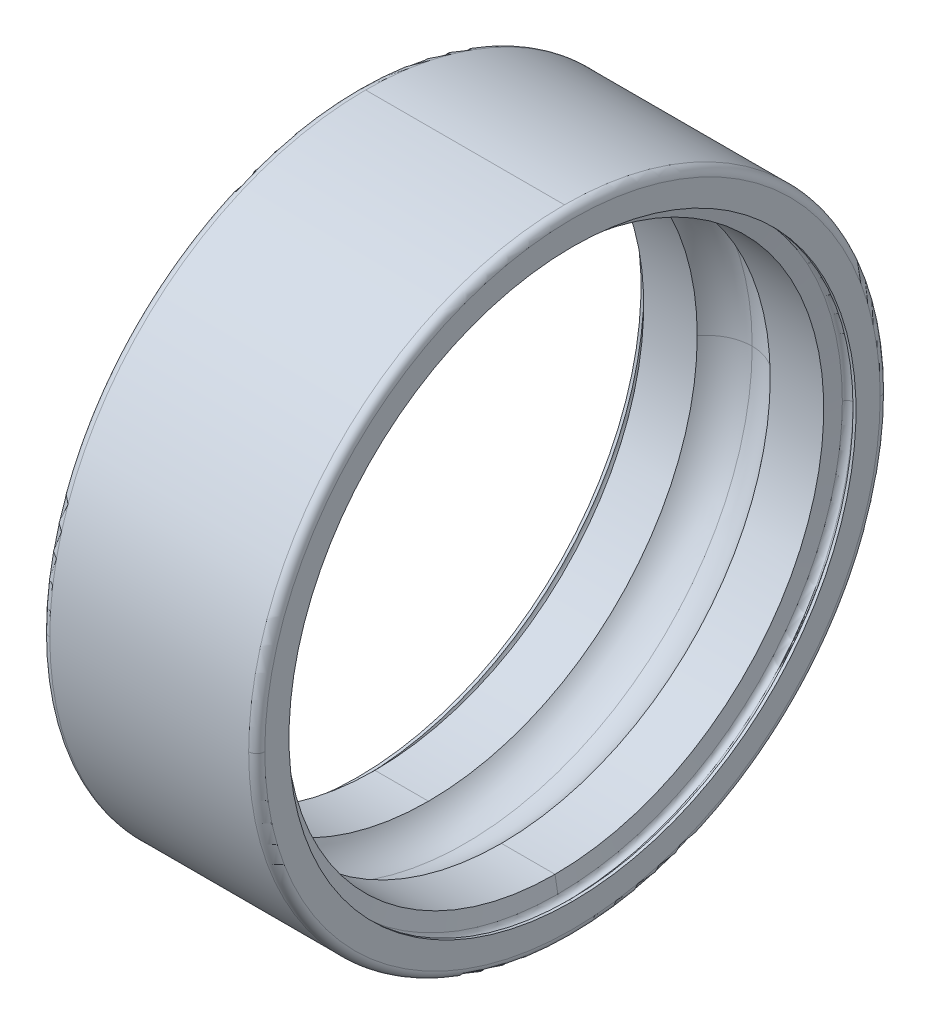
ISO-10303-21;
HEADER;
FILE_DESCRIPTION(('STEP AP214'),'2;1');
FILE_NAME('part.step','',(''),(''),'','','');
FILE_SCHEMA(('AUTOMOTIVE_DESIGN { 1 0 10303 214 1 1 1 1 }'));
ENDSEC;
DATA;
#1=APPLICATION_CONTEXT('core data for automotive mechanical design processes');
#2=APPLICATION_PROTOCOL_DEFINITION('international standard','automotive_design',2000,#1);
#3=PRODUCT_CONTEXT('',#1,'mechanical');
#4=PRODUCT('Part','Part','',(#3));
#5=PRODUCT_RELATED_PRODUCT_CATEGORY('part','',(#4));
#6=PRODUCT_DEFINITION_FORMATION('','',#4);
#7=PRODUCT_DEFINITION_CONTEXT('part definition',#1,'design');
#8=PRODUCT_DEFINITION('design','',#6,#7);
#9=PRODUCT_DEFINITION_SHAPE('','',#8);
#10=(LENGTH_UNIT() NAMED_UNIT(*) SI_UNIT(.MILLI.,.METRE.));
#11=(NAMED_UNIT(*) PLANE_ANGLE_UNIT() SI_UNIT($,.RADIAN.));
#12=(NAMED_UNIT(*) SI_UNIT($,.STERADIAN.) SOLID_ANGLE_UNIT());
#13=UNCERTAINTY_MEASURE_WITH_UNIT(LENGTH_MEASURE(1.E-05),#10,'distance_accuracy_value','');
#14=(GEOMETRIC_REPRESENTATION_CONTEXT(3) GLOBAL_UNCERTAINTY_ASSIGNED_CONTEXT((#13)) GLOBAL_UNIT_ASSIGNED_CONTEXT((#10,
#11,#12)) REPRESENTATION_CONTEXT('',''));
#15=CARTESIAN_POINT('',(0.,0.,0.));
#16=DIRECTION('',(0.,0.,1.));
#17=DIRECTION('',(1.,0.,0.));
#18=AXIS2_PLACEMENT_3D('',#15,#16,#17);
#19=CARTESIAN_POINT('',(15.34,0.,0.));
#20=DIRECTION('',(1.,0.,0.));
#21=DIRECTION('',(0.,0.,-1.));
#22=AXIS2_PLACEMENT_3D('',#19,#20,#21);
#23=TOROIDAL_SURFACE('',#22,21.1,0.44);
#24=CARTESIAN_POINT('',(15.34,0.,0.));
#25=DIRECTION('',(1.,0.,0.));
#26=DIRECTION('',(0.,0.,1.));
#27=AXIS2_PLACEMENT_3D('',#24,#25,#26);
#28=CIRCLE('',#27,21.54);
#29=CARTESIAN_POINT('',(15.34,0.,-21.54));
#30=VERTEX_POINT('',#29);
#31=CARTESIAN_POINT('',(15.34,0.,21.54));
#32=VERTEX_POINT('',#31);
#33=EDGE_CURVE('E184',#30,#32,#28,.T.);
#34=ORIENTED_EDGE('',*,*,#33,.T.);
#35=CARTESIAN_POINT('',(15.34,0.,21.1));
#36=DIRECTION('',(0.,-1.,0.));
#37=DIRECTION('',(0.,0.,1.));
#38=AXIS2_PLACEMENT_3D('',#35,#36,#37);
#39=CIRCLE('',#38,0.44);
#40=CARTESIAN_POINT('',(14.9066845886746,0.,21.1764051981735));
#41=VERTEX_POINT('',#40);
#42=EDGE_CURVE('E197',#32,#41,#39,.T.);
#43=ORIENTED_EDGE('',*,*,#42,.T.);
#44=CARTESIAN_POINT('',(14.9066845886746,0.,0.));
#45=DIRECTION('',(1.,0.,0.));
#46=DIRECTION('',(0.,1.,0.));
#47=AXIS2_PLACEMENT_3D('',#44,#45,#46);
#48=CIRCLE('',#47,21.1764051981735);
#49=CARTESIAN_POINT('',(14.9066845886746,21.1764051981735,0.));
#50=VERTEX_POINT('',#49);
#51=EDGE_CURVE('E31',#50,#41,#48,.T.);
#52=ORIENTED_EDGE('',*,*,#51,.F.);
#53=CARTESIAN_POINT('',(14.9066845886746,0.,0.));
#54=DIRECTION('',(1.,0.,0.));
#55=DIRECTION('',(0.,1.,0.));
#56=AXIS2_PLACEMENT_3D('',#53,#54,#55);
#57=CIRCLE('',#56,21.1764051981735);
#58=CARTESIAN_POINT('',(14.9066845886746,0.,-21.1764051981735));
#59=VERTEX_POINT('',#58);
#60=EDGE_CURVE('E185',#59,#50,#57,.T.);
#61=ORIENTED_EDGE('',*,*,#60,.F.);
#62=CARTESIAN_POINT('',(15.34,0.,-21.1));
#63=DIRECTION('',(0.,-1.,0.));
#64=DIRECTION('',(0.,0.,-1.));
#65=AXIS2_PLACEMENT_3D('',#62,#63,#64);
#66=CIRCLE('',#65,0.44);
#67=EDGE_CURVE('E181',#59,#30,#66,.T.);
#68=ORIENTED_EDGE('',*,*,#67,.T.);
#69=EDGE_LOOP('',(#34,#43,#52,#61,#68));
#70=FACE_BOUND('',#69,.T.);
#71=ADVANCED_FACE('F16',(#70),#23,.F.);
#72=CARTESIAN_POINT('',(15.89,0.,0.));
#73=DIRECTION('',(1.,0.,0.));
#74=DIRECTION('',(0.,1.,0.));
#75=AXIS2_PLACEMENT_3D('',#72,#73,#74);
#76=CYLINDRICAL_SURFACE('',#75,21.1);
#77=DIRECTION('',(1.,0.,0.));
#78=VECTOR('',#77,1.);
#79=CARTESIAN_POINT('',(15.89,21.1,0.));
#80=LINE('',#79,#78);
#81=CARTESIAN_POINT('',(15.78,21.1,0.));
#82=VERTEX_POINT('',#81);
#83=CARTESIAN_POINT('',(16.,21.1,0.));
#84=VERTEX_POINT('',#83);
#85=EDGE_CURVE('E312',#82,#84,#80,.T.);
#86=ORIENTED_EDGE('',*,*,#85,.T.);
#87=CARTESIAN_POINT('',(16.,0.,0.));
#88=DIRECTION('',(1.,0.,0.));
#89=DIRECTION('',(0.,1.,0.));
#90=AXIS2_PLACEMENT_3D('',#87,#88,#89);
#91=CIRCLE('',#90,21.1);
#92=CARTESIAN_POINT('',(16.,-21.1,0.));
#93=VERTEX_POINT('',#92);
#94=EDGE_CURVE('E11',#84,#93,#91,.T.);
#95=ORIENTED_EDGE('',*,*,#94,.T.);
#96=DIRECTION('',(-1.,0.,0.));
#97=VECTOR('',#96,1.);
#98=CARTESIAN_POINT('',(15.89,-21.1,0.));
#99=LINE('',#98,#97);
#100=CARTESIAN_POINT('',(15.78,-21.1,0.));
#101=VERTEX_POINT('',#100);
#102=EDGE_CURVE('E318',#93,#101,#99,.T.);
#103=ORIENTED_EDGE('',*,*,#102,.T.);
#104=CARTESIAN_POINT('',(15.78,0.,0.));
#105=DIRECTION('',(1.,0.,0.));
#106=DIRECTION('',(0.,1.,0.));
#107=AXIS2_PLACEMENT_3D('',#104,#105,#106);
#108=CIRCLE('',#107,21.1);
#109=CARTESIAN_POINT('',(15.78,0.,21.1));
#110=VERTEX_POINT('',#109);
#111=EDGE_CURVE('E201',#110,#101,#108,.T.);
#112=ORIENTED_EDGE('',*,*,#111,.F.);
#113=CARTESIAN_POINT('',(15.78,0.,0.));
#114=DIRECTION('',(1.,0.,0.));
#115=DIRECTION('',(0.,1.,0.));
#116=AXIS2_PLACEMENT_3D('',#113,#114,#115);
#117=CIRCLE('',#116,21.1);
#118=EDGE_CURVE('E240',#82,#110,#117,.T.);
#119=ORIENTED_EDGE('',*,*,#118,.F.);
#120=EDGE_LOOP('',(#86,#95,#103,#112,#119));
#121=FACE_BOUND('',#120,.T.);
#122=ADVANCED_FACE('F419',(#121),#76,.F.);
#123=CARTESIAN_POINT('',(16.,22.,0.));
#124=DIRECTION('',(1.,0.,0.));
#125=DIRECTION('',(0.,1.,0.));
#126=AXIS2_PLACEMENT_3D('',#123,#124,#125);
#127=PLANE('',#126);
#128=ORIENTED_EDGE('',*,*,#94,.F.);
#129=CARTESIAN_POINT('',(16.,0.,0.));
#130=DIRECTION('',(1.,0.,0.));
#131=DIRECTION('',(0.,1.,0.));
#132=AXIS2_PLACEMENT_3D('',#129,#130,#131);
#133=CIRCLE('',#132,21.1);
#134=EDGE_CURVE('E323',#93,#84,#133,.T.);
#135=ORIENTED_EDGE('',*,*,#134,.F.);
#136=EDGE_LOOP('',(#128,#135));
#137=FACE_BOUND('',#136,.T.);
#138=CARTESIAN_POINT('',(16.,0.,0.));
#139=DIRECTION('',(1.,0.,0.));
#140=DIRECTION('',(0.,1.,0.));
#141=AXIS2_PLACEMENT_3D('',#138,#139,#140);
#142=CIRCLE('',#141,22.9);
#143=CARTESIAN_POINT('',(16.,0.,22.9));
#144=VERTEX_POINT('',#143);
#145=CARTESIAN_POINT('',(16.,0.,-22.9));
#146=VERTEX_POINT('',#145);
#147=EDGE_CURVE('E19',#144,#146,#142,.T.);
#148=ORIENTED_EDGE('',*,*,#147,.T.);
#149=CARTESIAN_POINT('',(16.,0.,0.));
#150=DIRECTION('',(1.,0.,0.));
#151=DIRECTION('',(0.,1.,0.));
#152=AXIS2_PLACEMENT_3D('',#149,#150,#151);
#153=CIRCLE('',#152,22.9);
#154=EDGE_CURVE('E253',#146,#144,#153,.T.);
#155=ORIENTED_EDGE('',*,*,#154,.T.);
#156=EDGE_LOOP('',(#148,#155));
#157=FACE_BOUND('',#156,.T.);
#158=ADVANCED_FACE('F402',(#137,#157),#127,.T.);
#159=CARTESIAN_POINT('',(15.4,0.,0.));
#160=DIRECTION('',(1.,0.,0.));
#161=DIRECTION('',(0.,0.,-1.));
#162=AXIS2_PLACEMENT_3D('',#159,#160,#161);
#163=TOROIDAL_SURFACE('',#162,22.9,0.6);
#164=CARTESIAN_POINT('',(15.4,0.,-22.9));
#165=DIRECTION('',(0.,-1.,0.));
#166=DIRECTION('',(0.,0.,-1.));
#167=AXIS2_PLACEMENT_3D('',#164,#165,#166);
#168=CIRCLE('',#167,0.6);
#169=CARTESIAN_POINT('',(15.4,0.,-23.5));
#170=VERTEX_POINT('',#169);
#171=EDGE_CURVE('E326',#170,#146,#168,.T.);
#172=ORIENTED_EDGE('',*,*,#171,.T.);
#173=ORIENTED_EDGE('',*,*,#147,.F.);
#174=CARTESIAN_POINT('',(15.4,0.,22.9));
#175=DIRECTION('',(0.,-1.,0.));
#176=DIRECTION('',(0.,0.,1.));
#177=AXIS2_PLACEMENT_3D('',#174,#175,#176);
#178=CIRCLE('',#177,0.6);
#179=CARTESIAN_POINT('',(15.4,0.,23.5));
#180=VERTEX_POINT('',#179);
#181=EDGE_CURVE('E250',#144,#180,#178,.T.);
#182=ORIENTED_EDGE('',*,*,#181,.T.);
#183=CARTESIAN_POINT('',(15.4,0.,0.));
#184=DIRECTION('',(1.,0.,0.));
#185=DIRECTION('',(0.,1.,0.));
#186=AXIS2_PLACEMENT_3D('',#183,#184,#185);
#187=CIRCLE('',#186,23.5);
#188=CARTESIAN_POINT('',(15.4,-23.5,0.));
#189=VERTEX_POINT('',#188);
#190=EDGE_CURVE('E342',#180,#189,#187,.T.);
#191=ORIENTED_EDGE('',*,*,#190,.T.);
#192=CARTESIAN_POINT('',(15.4,0.,0.));
#193=DIRECTION('',(1.,0.,0.));
#194=DIRECTION('',(0.,1.,0.));
#195=AXIS2_PLACEMENT_3D('',#192,#193,#194);
#196=CIRCLE('',#195,23.5);
#197=EDGE_CURVE('E397',#189,#170,#196,.T.);
#198=ORIENTED_EDGE('',*,*,#197,.T.);
#199=EDGE_LOOP('',(#172,#173,#182,#191,#198));
#200=FACE_BOUND('',#199,.T.);
#201=ADVANCED_FACE('F407',(#200),#163,.T.);
#202=CARTESIAN_POINT('',(8.,0.,0.));
#203=DIRECTION('',(1.,0.,0.));
#204=DIRECTION('',(0.,1.,0.));
#205=AXIS2_PLACEMENT_3D('',#202,#203,#204);
#206=CYLINDRICAL_SURFACE('',#205,23.5);
#207=DIRECTION('',(1.,0.,0.));
#208=VECTOR('',#207,1.);
#209=CARTESIAN_POINT('',(8.,23.5,0.));
#210=LINE('',#209,#208);
#211=CARTESIAN_POINT('',(0.6,23.5,0.));
#212=VERTEX_POINT('',#211);
#213=CARTESIAN_POINT('',(15.4,23.5,0.));
#214=VERTEX_POINT('',#213);
#215=EDGE_CURVE('E336',#212,#214,#210,.T.);
#216=ORIENTED_EDGE('',*,*,#215,.T.);
#217=CARTESIAN_POINT('',(15.4,0.,0.));
#218=DIRECTION('',(1.,0.,0.));
#219=DIRECTION('',(0.,1.,0.));
#220=AXIS2_PLACEMENT_3D('',#217,#218,#219);
#221=CIRCLE('',#220,23.5);
#222=EDGE_CURVE('E329',#170,#214,#221,.T.);
#223=ORIENTED_EDGE('',*,*,#222,.F.);
#224=ORIENTED_EDGE('',*,*,#197,.F.);
#225=DIRECTION('',(-1.,0.,0.));
#226=VECTOR('',#225,1.);
#227=CARTESIAN_POINT('',(8.,-23.5,0.));
#228=LINE('',#227,#226);
#229=CARTESIAN_POINT('',(0.6,-23.5,0.));
#230=VERTEX_POINT('',#229);
#231=EDGE_CURVE('E281',#189,#230,#228,.T.);
#232=ORIENTED_EDGE('',*,*,#231,.T.);
#233=CARTESIAN_POINT('',(0.6,0.,0.));
#234=DIRECTION('',(1.,0.,0.));
#235=DIRECTION('',(0.,1.,0.));
#236=AXIS2_PLACEMENT_3D('',#233,#234,#235);
#237=CIRCLE('',#236,23.5);
#238=CARTESIAN_POINT('',(0.6,0.,-23.5));
#239=VERTEX_POINT('',#238);
#240=EDGE_CURVE('E369',#230,#239,#237,.T.);
#241=ORIENTED_EDGE('',*,*,#240,.T.);
#242=CARTESIAN_POINT('',(0.6,0.,0.));
#243=DIRECTION('',(1.,0.,0.));
#244=DIRECTION('',(0.,1.,0.));
#245=AXIS2_PLACEMENT_3D('',#242,#243,#244);
#246=CIRCLE('',#245,23.5);
#247=EDGE_CURVE('E359',#239,#212,#246,.T.);
#248=ORIENTED_EDGE('',*,*,#247,.T.);
#249=EDGE_LOOP('',(#216,#223,#224,#232,#241,#248));
#250=FACE_BOUND('',#249,.T.);
#251=ADVANCED_FACE('F409',(#250),#206,.T.);
#252=CARTESIAN_POINT('',(0.6,0.,0.));
#253=DIRECTION('',(1.,0.,0.));
#254=DIRECTION('',(0.,0.,-1.));
#255=AXIS2_PLACEMENT_3D('',#252,#253,#254);
#256=TOROIDAL_SURFACE('',#255,22.9,0.6);
#257=CARTESIAN_POINT('',(0.6,0.,-22.9));
#258=DIRECTION('',(0.,-1.,0.));
#259=DIRECTION('',(0.,0.,-1.));
#260=AXIS2_PLACEMENT_3D('',#257,#258,#259);
#261=CIRCLE('',#260,0.6);
#262=CARTESIAN_POINT('',(0.,0.,-22.9));
#263=VERTEX_POINT('',#262);
#264=EDGE_CURVE('E345',#263,#239,#261,.T.);
#265=ORIENTED_EDGE('',*,*,#264,.T.);
#266=ORIENTED_EDGE('',*,*,#240,.F.);
#267=CARTESIAN_POINT('',(0.6,0.,0.));
#268=DIRECTION('',(1.,0.,0.));
#269=DIRECTION('',(0.,1.,0.));
#270=AXIS2_PLACEMENT_3D('',#267,#268,#269);
#271=CIRCLE('',#270,23.5);
#272=CARTESIAN_POINT('',(0.6,0.,23.5));
#273=VERTEX_POINT('',#272);
#274=EDGE_CURVE('E278',#273,#230,#271,.T.);
#275=ORIENTED_EDGE('',*,*,#274,.F.);
#276=CARTESIAN_POINT('',(0.6,0.,22.9));
#277=DIRECTION('',(0.,-1.,0.));
#278=DIRECTION('',(0.,0.,1.));
#279=AXIS2_PLACEMENT_3D('',#276,#277,#278);
#280=CIRCLE('',#279,0.6);
#281=CARTESIAN_POINT('',(0.,0.,22.9));
#282=VERTEX_POINT('',#281);
#283=EDGE_CURVE('E356',#273,#282,#280,.T.);
#284=ORIENTED_EDGE('',*,*,#283,.T.);
#285=CARTESIAN_POINT('',(0.,0.,0.));
#286=DIRECTION('',(1.,0.,0.));
#287=DIRECTION('',(0.,1.,0.));
#288=AXIS2_PLACEMENT_3D('',#285,#286,#287);
#289=CIRCLE('',#288,22.9);
#290=EDGE_CURVE('E365',#282,#263,#289,.T.);
#291=ORIENTED_EDGE('',*,*,#290,.T.);
#292=EDGE_LOOP('',(#265,#266,#275,#284,#291));
#293=FACE_BOUND('',#292,.T.);
#294=ADVANCED_FACE('F416',(#293),#256,.T.);
#295=CARTESIAN_POINT('',(0.,22.,0.));
#296=DIRECTION('',(-1.,0.,0.));
#297=DIRECTION('',(0.,0.,1.));
#298=AXIS2_PLACEMENT_3D('',#295,#296,#297);
#299=PLANE('',#298);
#300=CARTESIAN_POINT('',(0.,0.,0.));
#301=DIRECTION('',(1.,0.,0.));
#302=DIRECTION('',(0.,1.,0.));
#303=AXIS2_PLACEMENT_3D('',#300,#301,#302);
#304=CIRCLE('',#303,21.1);
#305=CARTESIAN_POINT('',(0.,21.1,0.));
#306=VERTEX_POINT('',#305);
#307=CARTESIAN_POINT('',(0.,-21.1,0.));
#308=VERTEX_POINT('',#307);
#309=EDGE_CURVE('E361',#306,#308,#304,.T.);
#310=ORIENTED_EDGE('',*,*,#309,.T.);
#311=CARTESIAN_POINT('',(0.,0.,0.));
#312=DIRECTION('',(1.,0.,0.));
#313=DIRECTION('',(0.,1.,0.));
#314=AXIS2_PLACEMENT_3D('',#311,#312,#313);
#315=CIRCLE('',#314,21.1);
#316=EDGE_CURVE('E289',#308,#306,#315,.T.);
#317=ORIENTED_EDGE('',*,*,#316,.T.);
#318=EDGE_LOOP('',(#310,#317));
#319=FACE_BOUND('',#318,.T.);
#320=CARTESIAN_POINT('',(0.,0.,0.));
#321=DIRECTION('',(1.,0.,0.));
#322=DIRECTION('',(0.,1.,0.));
#323=AXIS2_PLACEMENT_3D('',#320,#321,#322);
#324=CIRCLE('',#323,22.9);
#325=EDGE_CURVE('E351',#263,#282,#324,.T.);
#326=ORIENTED_EDGE('',*,*,#325,.F.);
#327=ORIENTED_EDGE('',*,*,#290,.F.);
#328=EDGE_LOOP('',(#326,#327));
#329=FACE_BOUND('',#328,.T.);
#330=ADVANCED_FACE('F434',(#319,#329),#299,.T.);
#331=CARTESIAN_POINT('',(0.11,0.,0.));
#332=DIRECTION('',(1.,0.,0.));
#333=DIRECTION('',(0.,1.,0.));
#334=AXIS2_PLACEMENT_3D('',#331,#332,#333);
#335=CYLINDRICAL_SURFACE('',#334,21.1);
#336=DIRECTION('',(1.,0.,0.));
#337=VECTOR('',#336,1.);
#338=CARTESIAN_POINT('',(0.11,21.1,0.));
#339=LINE('',#338,#337);
#340=CARTESIAN_POINT('',(0.22,21.1,0.));
#341=VERTEX_POINT('',#340);
#342=EDGE_CURVE('E363',#306,#341,#339,.T.);
#343=ORIENTED_EDGE('',*,*,#342,.T.);
#344=CARTESIAN_POINT('',(0.22,0.,0.));
#345=DIRECTION('',(1.,0.,0.));
#346=DIRECTION('',(0.,1.,0.));
#347=AXIS2_PLACEMENT_3D('',#344,#345,#346);
#348=CIRCLE('',#347,21.1);
#349=CARTESIAN_POINT('',(0.22,0.,21.1));
#350=VERTEX_POINT('',#349);
#351=EDGE_CURVE('E353',#341,#350,#348,.T.);
#352=ORIENTED_EDGE('',*,*,#351,.T.);
#353=CARTESIAN_POINT('',(0.22,0.,0.));
#354=DIRECTION('',(1.,0.,0.));
#355=DIRECTION('',(0.,1.,0.));
#356=AXIS2_PLACEMENT_3D('',#353,#354,#355);
#357=CIRCLE('',#356,21.1);
#358=CARTESIAN_POINT('',(0.22,-21.1,0.));
#359=VERTEX_POINT('',#358);
#360=EDGE_CURVE('E300',#350,#359,#357,.T.);
#361=ORIENTED_EDGE('',*,*,#360,.T.);
#362=DIRECTION('',(-1.,0.,0.));
#363=VECTOR('',#362,1.);
#364=CARTESIAN_POINT('',(0.11,-21.1,0.));
#365=LINE('',#364,#363);
#366=EDGE_CURVE('E285',#359,#308,#365,.T.);
#367=ORIENTED_EDGE('',*,*,#366,.T.);
#368=ORIENTED_EDGE('',*,*,#309,.F.);
#369=EDGE_LOOP('',(#343,#352,#361,#367,#368));
#370=FACE_BOUND('',#369,.T.);
#371=ADVANCED_FACE('F438',(#370),#335,.F.);
#372=CARTESIAN_POINT('',(0.66,0.,0.));
#373=DIRECTION('',(1.,0.,0.));
#374=DIRECTION('',(0.,0.,-1.));
#375=AXIS2_PLACEMENT_3D('',#372,#373,#374);
#376=TOROIDAL_SURFACE('',#375,21.1,0.44);
#377=CARTESIAN_POINT('',(0.66,0.,0.));
#378=DIRECTION('',(1.,0.,0.));
#379=DIRECTION('',(0.,0.,1.));
#380=AXIS2_PLACEMENT_3D('',#377,#378,#379);
#381=CIRCLE('',#380,21.54);
#382=CARTESIAN_POINT('',(0.66,0.,-21.54));
#383=VERTEX_POINT('',#382);
#384=CARTESIAN_POINT('',(0.66,0.,21.54));
#385=VERTEX_POINT('',#384);
#386=EDGE_CURVE('E249',#383,#385,#381,.T.);
#387=ORIENTED_EDGE('',*,*,#386,.T.);
#388=CARTESIAN_POINT('',(0.66,0.,21.1));
#389=DIRECTION('',(0.,-1.,0.));
#390=DIRECTION('',(0.,0.,1.));
#391=AXIS2_PLACEMENT_3D('',#388,#389,#390);
#392=CIRCLE('',#391,0.44);
#393=EDGE_CURVE('E229',#385,#350,#392,.T.);
#394=ORIENTED_EDGE('',*,*,#393,.T.);
#395=ORIENTED_EDGE('',*,*,#351,.F.);
#396=CARTESIAN_POINT('',(0.22,0.,0.));
#397=DIRECTION('',(1.,0.,0.));
#398=DIRECTION('',(0.,1.,0.));
#399=AXIS2_PLACEMENT_3D('',#396,#397,#398);
#400=CIRCLE('',#399,21.1);
#401=CARTESIAN_POINT('',(0.22,0.,-21.1));
#402=VERTEX_POINT('',#401);
#403=EDGE_CURVE('E291',#402,#341,#400,.T.);
#404=ORIENTED_EDGE('',*,*,#403,.F.);
#405=CARTESIAN_POINT('',(0.66,0.,-21.1));
#406=DIRECTION('',(0.,-1.,0.));
#407=DIRECTION('',(0.,0.,-1.));
#408=AXIS2_PLACEMENT_3D('',#405,#406,#407);
#409=CIRCLE('',#408,0.44);
#410=EDGE_CURVE('E294',#402,#383,#409,.T.);
#411=ORIENTED_EDGE('',*,*,#410,.T.);
#412=EDGE_LOOP('',(#387,#394,#395,#404,#411));
#413=FACE_BOUND('',#412,.T.);
#414=ADVANCED_FACE('F440',(#413),#376,.F.);
#415=CARTESIAN_POINT('',(1.19703139966721,0.,0.));
#416=DIRECTION('',(-1.,0.,0.));
#417=DIRECTION('',(0.,1.,0.));
#418=AXIS2_PLACEMENT_3D('',#415,#416,#417);
#419=CONICAL_SURFACE('',#418,20.5882025990867,1.39626340159546);
#420=DIRECTION('',(0.17364817766693,-0.984807753012208,0.));
#421=VECTOR('',#420,1.);
#422=CARTESIAN_POINT('',(1.19703139966721,20.5882025990867,0.));
#423=LINE('',#422,#421);
#424=CARTESIAN_POINT('',(1.09331541132537,21.1764051981735,0.));
#425=VERTEX_POINT('',#424);
#426=CARTESIAN_POINT('',(1.30074738800904,20.,0.));
#427=VERTEX_POINT('',#426);
#428=EDGE_CURVE('E226',#425,#427,#423,.T.);
#429=ORIENTED_EDGE('',*,*,#428,.T.);
#430=CARTESIAN_POINT('',(1.30074738800904,0.,0.));
#431=DIRECTION('',(1.,0.,0.));
#432=DIRECTION('',(0.,1.,0.));
#433=AXIS2_PLACEMENT_3D('',#430,#431,#432);
#434=CIRCLE('',#433,20.);
#435=CARTESIAN_POINT('',(1.30074738800904,-20.,0.));
#436=VERTEX_POINT('',#435);
#437=EDGE_CURVE('E348',#427,#436,#434,.T.);
#438=ORIENTED_EDGE('',*,*,#437,.T.);
#439=DIRECTION('',(-0.17364817766693,-0.984807753012208,0.));
#440=VECTOR('',#439,1.);
#441=CARTESIAN_POINT('',(1.19703139966721,-20.5882025990867,0.));
#442=LINE('',#441,#440);
#443=CARTESIAN_POINT('',(1.09331541132537,-21.1764051981735,0.));
#444=VERTEX_POINT('',#443);
#445=EDGE_CURVE('E228',#436,#444,#442,.T.);
#446=ORIENTED_EDGE('',*,*,#445,.T.);
#447=CARTESIAN_POINT('',(1.09331541132537,0.,0.));
#448=DIRECTION('',(1.,0.,0.));
#449=DIRECTION('',(0.,1.,0.));
#450=AXIS2_PLACEMENT_3D('',#447,#448,#449);
#451=CIRCLE('',#450,21.1764051981735);
#452=CARTESIAN_POINT('',(1.09331541132537,0.,21.1764051981735));
#453=VERTEX_POINT('',#452);
#454=EDGE_CURVE('E234',#453,#444,#451,.T.);
#455=ORIENTED_EDGE('',*,*,#454,.F.);
#456=CARTESIAN_POINT('',(1.09331541132537,0.,0.));
#457=DIRECTION('',(1.,0.,0.));
#458=DIRECTION('',(0.,1.,0.));
#459=AXIS2_PLACEMENT_3D('',#456,#457,#458);
#460=CIRCLE('',#459,21.1764051981735);
#461=EDGE_CURVE('E263',#425,#453,#460,.T.);
#462=ORIENTED_EDGE('',*,*,#461,.F.);
#463=EDGE_LOOP('',(#429,#438,#446,#455,#462));
#464=FACE_BOUND('',#463,.T.);
#465=ADVANCED_FACE('F443',(#464),#419,.F.);
#466=CARTESIAN_POINT('',(3.29201970387529,0.,0.));
#467=DIRECTION('',(1.,0.,0.));
#468=DIRECTION('',(0.,1.,0.));
#469=AXIS2_PLACEMENT_3D('',#466,#467,#468);
#470=CYLINDRICAL_SURFACE('',#469,20.);
#471=DIRECTION('',(1.,0.,0.));
#472=VECTOR('',#471,1.);
#473=CARTESIAN_POINT('',(3.29201970387529,20.,0.));
#474=LINE('',#473,#472);
#475=CARTESIAN_POINT('',(5.28329201974155,20.,0.));
#476=VERTEX_POINT('',#475);
#477=EDGE_CURVE('E220',#427,#476,#474,.T.);
#478=ORIENTED_EDGE('',*,*,#477,.T.);
#479=CARTESIAN_POINT('',(5.28329201974155,0.,0.));
#480=DIRECTION('',(1.,0.,0.));
#481=DIRECTION('',(0.,1.,0.));
#482=AXIS2_PLACEMENT_3D('',#479,#480,#481);
#483=CIRCLE('',#482,20.);
#484=CARTESIAN_POINT('',(5.28329201974155,0.,20.));
#485=VERTEX_POINT('',#484);
#486=EDGE_CURVE('E346',#476,#485,#483,.T.);
#487=ORIENTED_EDGE('',*,*,#486,.T.);
#488=CARTESIAN_POINT('',(5.28329201974155,0.,0.));
#489=DIRECTION('',(1.,0.,0.));
#490=DIRECTION('',(0.,1.,0.));
#491=AXIS2_PLACEMENT_3D('',#488,#489,#490);
#492=CIRCLE('',#491,20.);
#493=CARTESIAN_POINT('',(5.28329201974155,-20.,0.));
#494=VERTEX_POINT('',#493);
#495=EDGE_CURVE('E377',#485,#494,#492,.T.);
#496=ORIENTED_EDGE('',*,*,#495,.T.);
#497=DIRECTION('',(-1.,0.,0.));
#498=VECTOR('',#497,1.);
#499=CARTESIAN_POINT('',(3.29201970387529,-20.,0.));
#500=LINE('',#499,#498);
#501=EDGE_CURVE('E269',#494,#436,#500,.T.);
#502=ORIENTED_EDGE('',*,*,#501,.T.);
#503=ORIENTED_EDGE('',*,*,#437,.F.);
#504=EDGE_LOOP('',(#478,#487,#496,#502,#503));
#505=FACE_BOUND('',#504,.T.);
#506=ADVANCED_FACE('F447',(#505),#470,.F.);
#507=CARTESIAN_POINT('',(8.,0.,0.));
#508=DIRECTION('',(1.,0.,0.));
#509=DIRECTION('',(0.,0.,-1.));
#510=AXIS2_PLACEMENT_3D('',#507,#508,#509);
#511=TOROIDAL_SURFACE('',#510,18.,3.3735);
#512=CARTESIAN_POINT('',(8.,0.,0.));
#513=DIRECTION('',(1.,0.,0.));
#514=DIRECTION('',(0.,0.,1.));
#515=AXIS2_PLACEMENT_3D('',#512,#513,#514);
#516=CIRCLE('',#515,21.3735);
#517=CARTESIAN_POINT('',(8.,0.,-21.3735));
#518=VERTEX_POINT('',#517);
#519=CARTESIAN_POINT('',(8.,0.,21.3735));
#520=VERTEX_POINT('',#519);
#521=EDGE_CURVE('E247',#518,#520,#516,.T.);
#522=ORIENTED_EDGE('',*,*,#521,.T.);
#523=CARTESIAN_POINT('',(8.,0.,18.));
#524=DIRECTION('',(0.,-1.,0.));
#525=DIRECTION('',(0.,0.,1.));
#526=AXIS2_PLACEMENT_3D('',#523,#524,#525);
#527=CIRCLE('',#526,3.3735);
#528=EDGE_CURVE('E379',#520,#485,#527,.T.);
#529=ORIENTED_EDGE('',*,*,#528,.T.);
#530=ORIENTED_EDGE('',*,*,#486,.F.);
#531=CARTESIAN_POINT('',(5.28329201974155,0.,0.));
#532=DIRECTION('',(1.,0.,0.));
#533=DIRECTION('',(0.,1.,0.));
#534=AXIS2_PLACEMENT_3D('',#531,#532,#533);
#535=CIRCLE('',#534,20.);
#536=CARTESIAN_POINT('',(5.28329201974155,0.,-20.));
#537=VERTEX_POINT('',#536);
#538=EDGE_CURVE('E315',#537,#476,#535,.T.);
#539=ORIENTED_EDGE('',*,*,#538,.F.);
#540=CARTESIAN_POINT('',(8.,0.,-18.));
#541=DIRECTION('',(0.,-1.,0.));
#542=DIRECTION('',(0.,0.,-1.));
#543=AXIS2_PLACEMENT_3D('',#540,#541,#542);
#544=CIRCLE('',#543,3.3735);
#545=EDGE_CURVE('E321',#537,#518,#544,.T.);
#546=ORIENTED_EDGE('',*,*,#545,.T.);
#547=EDGE_LOOP('',(#522,#529,#530,#539,#546));
#548=FACE_BOUND('',#547,.T.);
#549=ADVANCED_FACE('F451',(#548),#511,.F.);
#550=CARTESIAN_POINT('',(12.7079802961247,0.,0.));
#551=DIRECTION('',(1.,0.,0.));
#552=DIRECTION('',(0.,1.,0.));
#553=AXIS2_PLACEMENT_3D('',#550,#551,#552);
#554=CYLINDRICAL_SURFACE('',#553,20.);
#555=DIRECTION('',(1.,0.,0.));
#556=VECTOR('',#555,1.);
#557=CARTESIAN_POINT('',(12.7079802961247,20.,0.));
#558=LINE('',#557,#556);
#559=CARTESIAN_POINT('',(10.7167079802585,20.,0.));
#560=VERTEX_POINT('',#559);
#561=CARTESIAN_POINT('',(14.699252611991,20.,0.));
#562=VERTEX_POINT('',#561);
#563=EDGE_CURVE('E382',#560,#562,#558,.T.);
#564=ORIENTED_EDGE('',*,*,#563,.T.);
#565=CARTESIAN_POINT('',(14.699252611991,0.,0.));
#566=DIRECTION('',(1.,0.,0.));
#567=DIRECTION('',(0.,1.,0.));
#568=AXIS2_PLACEMENT_3D('',#565,#566,#567);
#569=CIRCLE('',#568,20.);
#570=CARTESIAN_POINT('',(14.699252611991,-20.,0.));
#571=VERTEX_POINT('',#570);
#572=EDGE_CURVE('E39',#562,#571,#569,.T.);
#573=ORIENTED_EDGE('',*,*,#572,.T.);
#574=DIRECTION('',(-1.,0.,0.));
#575=VECTOR('',#574,1.);
#576=CARTESIAN_POINT('',(12.7079802961247,-20.,0.));
#577=LINE('',#576,#575);
#578=CARTESIAN_POINT('',(10.7167079802585,-20.,0.));
#579=VERTEX_POINT('',#578);
#580=EDGE_CURVE('E384',#571,#579,#577,.T.);
#581=ORIENTED_EDGE('',*,*,#580,.T.);
#582=CARTESIAN_POINT('',(10.7167079802585,0.,0.));
#583=DIRECTION('',(1.,0.,0.));
#584=DIRECTION('',(0.,1.,0.));
#585=AXIS2_PLACEMENT_3D('',#582,#583,#584);
#586=CIRCLE('',#585,20.);
#587=CARTESIAN_POINT('',(10.7167079802585,0.,20.));
#588=VERTEX_POINT('',#587);
#589=EDGE_CURVE('E277',#588,#579,#586,.T.);
#590=ORIENTED_EDGE('',*,*,#589,.F.);
#591=CARTESIAN_POINT('',(10.7167079802585,0.,0.));
#592=DIRECTION('',(1.,0.,0.));
#593=DIRECTION('',(0.,1.,0.));
#594=AXIS2_PLACEMENT_3D('',#591,#592,#593);
#595=CIRCLE('',#594,20.);
#596=EDGE_CURVE('E223',#560,#588,#595,.T.);
#597=ORIENTED_EDGE('',*,*,#596,.F.);
#598=EDGE_LOOP('',(#564,#573,#581,#590,#597));
#599=FACE_BOUND('',#598,.T.);
#600=ADVANCED_FACE('F453',(#599),#554,.F.);
#601=CARTESIAN_POINT('',(14.8029686003328,0.,0.));
#602=DIRECTION('',(1.,0.,0.));
#603=DIRECTION('',(0.,1.,0.));
#604=AXIS2_PLACEMENT_3D('',#601,#602,#603);
#605=CONICAL_SURFACE('',#604,20.5882025990867,1.39626340159547);
#606=DIRECTION('',(0.173648177666928,0.984807753012208,0.));
#607=VECTOR('',#606,1.);
#608=CARTESIAN_POINT('',(14.8029686003328,20.5882025990867,0.));
#609=LINE('',#608,#607);
#610=EDGE_CURVE('E389',#562,#50,#609,.T.);
#611=ORIENTED_EDGE('',*,*,#610,.T.);
#612=ORIENTED_EDGE('',*,*,#51,.T.);
#613=CARTESIAN_POINT('',(14.9066845886746,0.,0.));
#614=DIRECTION('',(1.,0.,0.));
#615=DIRECTION('',(0.,1.,0.));
#616=AXIS2_PLACEMENT_3D('',#613,#614,#615);
#617=CIRCLE('',#616,21.1764051981735);
#618=CARTESIAN_POINT('',(14.9066845886746,-21.1764051981735,0.));
#619=VERTEX_POINT('',#618);
#620=EDGE_CURVE('E308',#41,#619,#617,.T.);
#621=ORIENTED_EDGE('',*,*,#620,.T.);
#622=DIRECTION('',(-0.173648177666928,0.984807753012208,0.));
#623=VECTOR('',#622,1.);
#624=CARTESIAN_POINT('',(14.8029686003328,-20.5882025990867,0.));
#625=LINE('',#624,#623);
#626=EDGE_CURVE('E392',#619,#571,#625,.T.);
#627=ORIENTED_EDGE('',*,*,#626,.T.);
#628=ORIENTED_EDGE('',*,*,#572,.F.);
#629=EDGE_LOOP('',(#611,#612,#621,#627,#628));
#630=FACE_BOUND('',#629,.T.);
#631=ADVANCED_FACE('F456',(#630),#605,.F.);
#632=CARTESIAN_POINT('',(14.8029686003328,0.,0.));
#633=DIRECTION('',(1.,0.,0.));
#634=DIRECTION('',(0.,1.,0.));
#635=AXIS2_PLACEMENT_3D('',#632,#633,#634);
#636=CONICAL_SURFACE('',#635,20.5882025990867,1.39626340159547);
#637=ORIENTED_EDGE('',*,*,#610,.F.);
#638=CARTESIAN_POINT('',(14.699252611991,0.,0.));
#639=DIRECTION('',(1.,0.,0.));
#640=DIRECTION('',(0.,1.,0.));
#641=AXIS2_PLACEMENT_3D('',#638,#639,#640);
#642=CIRCLE('',#641,20.);
#643=EDGE_CURVE('E386',#571,#562,#642,.T.);
#644=ORIENTED_EDGE('',*,*,#643,.F.);
#645=ORIENTED_EDGE('',*,*,#626,.F.);
#646=CARTESIAN_POINT('',(14.9066845886746,0.,0.));
#647=DIRECTION('',(1.,0.,0.));
#648=DIRECTION('',(0.,1.,0.));
#649=AXIS2_PLACEMENT_3D('',#646,#647,#648);
#650=CIRCLE('',#649,21.1764051981735);
#651=EDGE_CURVE('E189',#619,#59,#650,.T.);
#652=ORIENTED_EDGE('',*,*,#651,.T.);
#653=ORIENTED_EDGE('',*,*,#60,.T.);
#654=EDGE_LOOP('',(#637,#644,#645,#652,#653));
#655=FACE_BOUND('',#654,.T.);
#656=ADVANCED_FACE('F459',(#655),#636,.F.);
#657=CARTESIAN_POINT('',(12.7079802961247,0.,0.));
#658=DIRECTION('',(1.,0.,0.));
#659=DIRECTION('',(0.,1.,0.));
#660=AXIS2_PLACEMENT_3D('',#657,#658,#659);
#661=CYLINDRICAL_SURFACE('',#660,20.);
#662=ORIENTED_EDGE('',*,*,#563,.F.);
#663=CARTESIAN_POINT('',(10.7167079802585,0.,0.));
#664=DIRECTION('',(1.,0.,0.));
#665=DIRECTION('',(0.,1.,0.));
#666=AXIS2_PLACEMENT_3D('',#663,#664,#665);
#667=CIRCLE('',#666,20.);
#668=CARTESIAN_POINT('',(10.7167079802585,0.,-20.));
#669=VERTEX_POINT('',#668);
#670=EDGE_CURVE('E221',#669,#560,#667,.T.);
#671=ORIENTED_EDGE('',*,*,#670,.F.);
#672=CARTESIAN_POINT('',(10.7167079802585,0.,0.));
#673=DIRECTION('',(1.,0.,0.));
#674=DIRECTION('',(0.,1.,0.));
#675=AXIS2_PLACEMENT_3D('',#672,#673,#674);
#676=CIRCLE('',#675,20.);
#677=EDGE_CURVE('E235',#579,#669,#676,.T.);
#678=ORIENTED_EDGE('',*,*,#677,.F.);
#679=ORIENTED_EDGE('',*,*,#580,.F.);
#680=ORIENTED_EDGE('',*,*,#643,.T.);
#681=EDGE_LOOP('',(#662,#671,#678,#679,#680));
#682=FACE_BOUND('',#681,.T.);
#683=ADVANCED_FACE('F463',(#682),#661,.F.);
#684=CARTESIAN_POINT('',(8.,0.,0.));
#685=DIRECTION('',(1.,0.,0.));
#686=DIRECTION('',(0.,0.,-1.));
#687=AXIS2_PLACEMENT_3D('',#684,#685,#686);
#688=TOROIDAL_SURFACE('',#687,18.,3.3735);
#689=CARTESIAN_POINT('',(8.,0.,0.));
#690=DIRECTION('',(1.,0.,0.));
#691=DIRECTION('',(0.,0.,1.));
#692=AXIS2_PLACEMENT_3D('',#689,#690,#691);
#693=CIRCLE('',#692,21.3735);
#694=EDGE_CURVE('E242',#520,#518,#693,.T.);
#695=ORIENTED_EDGE('',*,*,#694,.T.);
#696=ORIENTED_EDGE('',*,*,#545,.F.);
#697=CARTESIAN_POINT('',(5.28329201974155,0.,0.));
#698=DIRECTION('',(1.,0.,0.));
#699=DIRECTION('',(0.,1.,0.));
#700=AXIS2_PLACEMENT_3D('',#697,#698,#699);
#701=CIRCLE('',#700,20.);
#702=EDGE_CURVE('E272',#494,#537,#701,.T.);
#703=ORIENTED_EDGE('',*,*,#702,.F.);
#704=ORIENTED_EDGE('',*,*,#495,.F.);
#705=ORIENTED_EDGE('',*,*,#528,.F.);
#706=EDGE_LOOP('',(#695,#696,#703,#704,#705));
#707=FACE_BOUND('',#706,.T.);
#708=ADVANCED_FACE('F467',(#707),#688,.F.);
#709=CARTESIAN_POINT('',(3.29201970387529,0.,0.));
#710=DIRECTION('',(1.,0.,0.));
#711=DIRECTION('',(0.,1.,0.));
#712=AXIS2_PLACEMENT_3D('',#709,#710,#711);
#713=CYLINDRICAL_SURFACE('',#712,20.);
#714=ORIENTED_EDGE('',*,*,#477,.F.);
#715=CARTESIAN_POINT('',(1.30074738800904,0.,0.));
#716=DIRECTION('',(1.,0.,0.));
#717=DIRECTION('',(0.,1.,0.));
#718=AXIS2_PLACEMENT_3D('',#715,#716,#717);
#719=CIRCLE('',#718,20.);
#720=EDGE_CURVE('E303',#436,#427,#719,.T.);
#721=ORIENTED_EDGE('',*,*,#720,.F.);
#722=ORIENTED_EDGE('',*,*,#501,.F.);
#723=ORIENTED_EDGE('',*,*,#702,.T.);
#724=ORIENTED_EDGE('',*,*,#538,.T.);
#725=EDGE_LOOP('',(#714,#721,#722,#723,#724));
#726=FACE_BOUND('',#725,.T.);
#727=ADVANCED_FACE('F473',(#726),#713,.F.);
#728=CARTESIAN_POINT('',(1.19703139966721,0.,0.));
#729=DIRECTION('',(-1.,0.,0.));
#730=DIRECTION('',(0.,1.,0.));
#731=AXIS2_PLACEMENT_3D('',#728,#729,#730);
#732=CONICAL_SURFACE('',#731,20.5882025990867,1.39626340159546);
#733=ORIENTED_EDGE('',*,*,#428,.F.);
#734=CARTESIAN_POINT('',(1.09331541132537,0.,0.));
#735=DIRECTION('',(1.,0.,0.));
#736=DIRECTION('',(0.,1.,0.));
#737=AXIS2_PLACEMENT_3D('',#734,#735,#736);
#738=CIRCLE('',#737,21.1764051981735);
#739=CARTESIAN_POINT('',(1.09331541132537,0.,-21.1764051981735));
#740=VERTEX_POINT('',#739);
#741=EDGE_CURVE('E260',#740,#425,#738,.T.);
#742=ORIENTED_EDGE('',*,*,#741,.F.);
#743=CARTESIAN_POINT('',(1.09331541132537,0.,0.));
#744=DIRECTION('',(1.,0.,0.));
#745=DIRECTION('',(0.,1.,0.));
#746=AXIS2_PLACEMENT_3D('',#743,#744,#745);
#747=CIRCLE('',#746,21.1764051981735);
#748=EDGE_CURVE('E202',#444,#740,#747,.T.);
#749=ORIENTED_EDGE('',*,*,#748,.F.);
#750=ORIENTED_EDGE('',*,*,#445,.F.);
#751=ORIENTED_EDGE('',*,*,#720,.T.);
#752=EDGE_LOOP('',(#733,#742,#749,#750,#751));
#753=FACE_BOUND('',#752,.T.);
#754=ADVANCED_FACE('F469',(#753),#732,.F.);
#755=CARTESIAN_POINT('',(0.66,0.,0.));
#756=DIRECTION('',(1.,0.,0.));
#757=DIRECTION('',(0.,0.,-1.));
#758=AXIS2_PLACEMENT_3D('',#755,#756,#757);
#759=TOROIDAL_SURFACE('',#758,21.1,0.44);
#760=CARTESIAN_POINT('',(0.66,0.,0.));
#761=DIRECTION('',(1.,0.,0.));
#762=DIRECTION('',(0.,0.,1.));
#763=AXIS2_PLACEMENT_3D('',#760,#761,#762);
#764=CIRCLE('',#763,21.54);
#765=EDGE_CURVE('E231',#385,#383,#764,.T.);
#766=ORIENTED_EDGE('',*,*,#765,.T.);
#767=ORIENTED_EDGE('',*,*,#410,.F.);
#768=CARTESIAN_POINT('',(0.22,0.,0.));
#769=DIRECTION('',(1.,0.,0.));
#770=DIRECTION('',(0.,1.,0.));
#771=AXIS2_PLACEMENT_3D('',#768,#769,#770);
#772=CIRCLE('',#771,21.1);
#773=EDGE_CURVE('E288',#359,#402,#772,.T.);
#774=ORIENTED_EDGE('',*,*,#773,.F.);
#775=ORIENTED_EDGE('',*,*,#360,.F.);
#776=ORIENTED_EDGE('',*,*,#393,.F.);
#777=EDGE_LOOP('',(#766,#767,#774,#775,#776));
#778=FACE_BOUND('',#777,.T.);
#779=ADVANCED_FACE('F472',(#778),#759,.F.);
#780=CARTESIAN_POINT('',(0.11,0.,0.));
#781=DIRECTION('',(1.,0.,0.));
#782=DIRECTION('',(0.,1.,0.));
#783=AXIS2_PLACEMENT_3D('',#780,#781,#782);
#784=CYLINDRICAL_SURFACE('',#783,21.1);
#785=ORIENTED_EDGE('',*,*,#342,.F.);
#786=ORIENTED_EDGE('',*,*,#316,.F.);
#787=ORIENTED_EDGE('',*,*,#366,.F.);
#788=ORIENTED_EDGE('',*,*,#773,.T.);
#789=ORIENTED_EDGE('',*,*,#403,.T.);
#790=EDGE_LOOP('',(#785,#786,#787,#788,#789));
#791=FACE_BOUND('',#790,.T.);
#792=ADVANCED_FACE('F475',(#791),#784,.F.);
#793=CARTESIAN_POINT('',(0.6,0.,0.));
#794=DIRECTION('',(1.,0.,0.));
#795=DIRECTION('',(0.,0.,-1.));
#796=AXIS2_PLACEMENT_3D('',#793,#794,#795);
#797=TOROIDAL_SURFACE('',#796,22.9,0.6);
#798=ORIENTED_EDGE('',*,*,#264,.F.);
#799=ORIENTED_EDGE('',*,*,#325,.T.);
#800=ORIENTED_EDGE('',*,*,#283,.F.);
#801=CARTESIAN_POINT('',(0.6,0.,0.));
#802=DIRECTION('',(1.,0.,0.));
#803=DIRECTION('',(0.,1.,0.));
#804=AXIS2_PLACEMENT_3D('',#801,#802,#803);
#805=CIRCLE('',#804,23.5);
#806=EDGE_CURVE('E282',#212,#273,#805,.T.);
#807=ORIENTED_EDGE('',*,*,#806,.F.);
#808=ORIENTED_EDGE('',*,*,#247,.F.);
#809=EDGE_LOOP('',(#798,#799,#800,#807,#808));
#810=FACE_BOUND('',#809,.T.);
#811=ADVANCED_FACE('F478',(#810),#797,.T.);
#812=CARTESIAN_POINT('',(8.,0.,0.));
#813=DIRECTION('',(1.,0.,0.));
#814=DIRECTION('',(0.,1.,0.));
#815=AXIS2_PLACEMENT_3D('',#812,#813,#814);
#816=CYLINDRICAL_SURFACE('',#815,23.5);
#817=ORIENTED_EDGE('',*,*,#215,.F.);
#818=ORIENTED_EDGE('',*,*,#806,.T.);
#819=ORIENTED_EDGE('',*,*,#274,.T.);
#820=ORIENTED_EDGE('',*,*,#231,.F.);
#821=ORIENTED_EDGE('',*,*,#190,.F.);
#822=CARTESIAN_POINT('',(15.4,0.,0.));
#823=DIRECTION('',(1.,0.,0.));
#824=DIRECTION('',(0.,1.,0.));
#825=AXIS2_PLACEMENT_3D('',#822,#823,#824);
#826=CIRCLE('',#825,23.5);
#827=EDGE_CURVE('E254',#214,#180,#826,.T.);
#828=ORIENTED_EDGE('',*,*,#827,.F.);
#829=EDGE_LOOP('',(#817,#818,#819,#820,#821,#828));
#830=FACE_BOUND('',#829,.T.);
#831=ADVANCED_FACE('F489',(#830),#816,.T.);
#832=CARTESIAN_POINT('',(15.4,0.,0.));
#833=DIRECTION('',(1.,0.,0.));
#834=DIRECTION('',(0.,0.,-1.));
#835=AXIS2_PLACEMENT_3D('',#832,#833,#834);
#836=TOROIDAL_SURFACE('',#835,22.9,0.6);
#837=ORIENTED_EDGE('',*,*,#171,.F.);
#838=ORIENTED_EDGE('',*,*,#222,.T.);
#839=ORIENTED_EDGE('',*,*,#827,.T.);
#840=ORIENTED_EDGE('',*,*,#181,.F.);
#841=ORIENTED_EDGE('',*,*,#154,.F.);
#842=EDGE_LOOP('',(#837,#838,#839,#840,#841));
#843=FACE_BOUND('',#842,.T.);
#844=ADVANCED_FACE('F406',(#843),#836,.T.);
#845=CARTESIAN_POINT('',(15.89,0.,0.));
#846=DIRECTION('',(1.,0.,0.));
#847=DIRECTION('',(0.,1.,0.));
#848=AXIS2_PLACEMENT_3D('',#845,#846,#847);
#849=CYLINDRICAL_SURFACE('',#848,21.1);
#850=ORIENTED_EDGE('',*,*,#85,.F.);
#851=CARTESIAN_POINT('',(15.78,0.,0.));
#852=DIRECTION('',(1.,0.,0.));
#853=DIRECTION('',(0.,1.,0.));
#854=AXIS2_PLACEMENT_3D('',#851,#852,#853);
#855=CIRCLE('',#854,21.1);
#856=CARTESIAN_POINT('',(15.78,0.,-21.1));
#857=VERTEX_POINT('',#856);
#858=EDGE_CURVE('E212',#857,#82,#855,.T.);
#859=ORIENTED_EDGE('',*,*,#858,.F.);
#860=CARTESIAN_POINT('',(15.78,0.,0.));
#861=DIRECTION('',(1.,0.,0.));
#862=DIRECTION('',(0.,1.,0.));
#863=AXIS2_PLACEMENT_3D('',#860,#861,#862);
#864=CIRCLE('',#863,21.1);
#865=EDGE_CURVE('E190',#101,#857,#864,.T.);
#866=ORIENTED_EDGE('',*,*,#865,.F.);
#867=ORIENTED_EDGE('',*,*,#102,.F.);
#868=ORIENTED_EDGE('',*,*,#134,.T.);
#869=EDGE_LOOP('',(#850,#859,#866,#867,#868));
#870=FACE_BOUND('',#869,.T.);
#871=ADVANCED_FACE('F488',(#870),#849,.F.);
#872=CARTESIAN_POINT('',(15.34,0.,0.));
#873=DIRECTION('',(1.,0.,0.));
#874=DIRECTION('',(0.,0.,-1.));
#875=AXIS2_PLACEMENT_3D('',#872,#873,#874);
#876=TOROIDAL_SURFACE('',#875,21.1,0.44);
#877=CARTESIAN_POINT('',(15.34,0.,0.));
#878=DIRECTION('',(1.,0.,0.));
#879=DIRECTION('',(0.,0.,1.));
#880=AXIS2_PLACEMENT_3D('',#877,#878,#879);
#881=CIRCLE('',#880,21.54);
#882=EDGE_CURVE('E193',#32,#30,#881,.T.);
#883=ORIENTED_EDGE('',*,*,#882,.T.);
#884=ORIENTED_EDGE('',*,*,#67,.F.);
#885=ORIENTED_EDGE('',*,*,#651,.F.);
#886=ORIENTED_EDGE('',*,*,#620,.F.);
#887=ORIENTED_EDGE('',*,*,#42,.F.);
#888=EDGE_LOOP('',(#883,#884,#885,#886,#887));
#889=FACE_BOUND('',#888,.T.);
#890=ADVANCED_FACE('F195',(#889),#876,.F.);
#891=CARTESIAN_POINT('',(15.34,0.,0.));
#892=DIRECTION('',(1.,0.,0.));
#893=DIRECTION('',(0.,0.,-1.));
#894=AXIS2_PLACEMENT_3D('',#891,#892,#893);
#895=TOROIDAL_SURFACE('',#894,21.1,0.44);
#896=ORIENTED_EDGE('',*,*,#882,.F.);
#897=CARTESIAN_POINT('',(15.34,0.,21.1));
#898=DIRECTION('',(0.,-1.,0.));
#899=DIRECTION('',(0.,0.,1.));
#900=AXIS2_PLACEMENT_3D('',#897,#898,#899);
#901=CIRCLE('',#900,0.44);
#902=EDGE_CURVE('E216',#110,#32,#901,.T.);
#903=ORIENTED_EDGE('',*,*,#902,.F.);
#904=ORIENTED_EDGE('',*,*,#111,.T.);
#905=ORIENTED_EDGE('',*,*,#865,.T.);
#906=CARTESIAN_POINT('',(15.34,0.,-21.1));
#907=DIRECTION('',(0.,-1.,0.));
#908=DIRECTION('',(0.,0.,-1.));
#909=AXIS2_PLACEMENT_3D('',#906,#907,#908);
#910=CIRCLE('',#909,0.44);
#911=EDGE_CURVE('E205',#30,#857,#910,.T.);
#912=ORIENTED_EDGE('',*,*,#911,.F.);
#913=EDGE_LOOP('',(#896,#903,#904,#905,#912));
#914=FACE_BOUND('',#913,.T.);
#915=ADVANCED_FACE('F206',(#914),#895,.F.);
#916=CARTESIAN_POINT('',(0.66,0.,0.));
#917=DIRECTION('',(1.,0.,0.));
#918=DIRECTION('',(0.,0.,-1.));
#919=AXIS2_PLACEMENT_3D('',#916,#917,#918);
#920=TOROIDAL_SURFACE('',#919,21.1,0.44);
#921=ORIENTED_EDGE('',*,*,#765,.F.);
#922=CARTESIAN_POINT('',(0.66,0.,21.1));
#923=DIRECTION('',(0.,-1.,0.));
#924=DIRECTION('',(0.,0.,1.));
#925=AXIS2_PLACEMENT_3D('',#922,#923,#924);
#926=CIRCLE('',#925,0.44);
#927=EDGE_CURVE('E266',#453,#385,#926,.T.);
#928=ORIENTED_EDGE('',*,*,#927,.F.);
#929=ORIENTED_EDGE('',*,*,#454,.T.);
#930=ORIENTED_EDGE('',*,*,#748,.T.);
#931=CARTESIAN_POINT('',(0.66,0.,-21.1));
#932=DIRECTION('',(0.,-1.,0.));
#933=DIRECTION('',(0.,0.,-1.));
#934=AXIS2_PLACEMENT_3D('',#931,#932,#933);
#935=CIRCLE('',#934,0.44);
#936=EDGE_CURVE('E257',#383,#740,#935,.T.);
#937=ORIENTED_EDGE('',*,*,#936,.F.);
#938=EDGE_LOOP('',(#921,#928,#929,#930,#937));
#939=FACE_BOUND('',#938,.T.);
#940=ADVANCED_FACE('F500',(#939),#920,.F.);
#941=CARTESIAN_POINT('',(8.,0.,0.));
#942=DIRECTION('',(1.,0.,0.));
#943=DIRECTION('',(0.,0.,-1.));
#944=AXIS2_PLACEMENT_3D('',#941,#942,#943);
#945=TOROIDAL_SURFACE('',#944,18.,3.3735);
#946=ORIENTED_EDGE('',*,*,#694,.F.);
#947=CARTESIAN_POINT('',(8.,0.,18.));
#948=DIRECTION('',(0.,-1.,0.));
#949=DIRECTION('',(0.,0.,1.));
#950=AXIS2_PLACEMENT_3D('',#947,#948,#949);
#951=CIRCLE('',#950,3.3735);
#952=EDGE_CURVE('E238',#588,#520,#951,.T.);
#953=ORIENTED_EDGE('',*,*,#952,.F.);
#954=ORIENTED_EDGE('',*,*,#589,.T.);
#955=ORIENTED_EDGE('',*,*,#677,.T.);
#956=CARTESIAN_POINT('',(8.,0.,-18.));
#957=DIRECTION('',(0.,-1.,0.));
#958=DIRECTION('',(0.,0.,-1.));
#959=AXIS2_PLACEMENT_3D('',#956,#957,#958);
#960=CIRCLE('',#959,3.3735);
#961=EDGE_CURVE('E224',#518,#669,#960,.T.);
#962=ORIENTED_EDGE('',*,*,#961,.F.);
#963=EDGE_LOOP('',(#946,#953,#954,#955,#962));
#964=FACE_BOUND('',#963,.T.);
#965=ADVANCED_FACE('F504',(#964),#945,.F.);
#966=CARTESIAN_POINT('',(8.,0.,0.));
#967=DIRECTION('',(1.,0.,0.));
#968=DIRECTION('',(0.,0.,-1.));
#969=AXIS2_PLACEMENT_3D('',#966,#967,#968);
#970=TOROIDAL_SURFACE('',#969,18.,3.3735);
#971=ORIENTED_EDGE('',*,*,#521,.F.);
#972=ORIENTED_EDGE('',*,*,#961,.T.);
#973=ORIENTED_EDGE('',*,*,#670,.T.);
#974=ORIENTED_EDGE('',*,*,#596,.T.);
#975=ORIENTED_EDGE('',*,*,#952,.T.);
#976=EDGE_LOOP('',(#971,#972,#973,#974,#975));
#977=FACE_BOUND('',#976,.T.);
#978=ADVANCED_FACE('F509',(#977),#970,.F.);
#979=CARTESIAN_POINT('',(0.66,0.,0.));
#980=DIRECTION('',(1.,0.,0.));
#981=DIRECTION('',(0.,0.,-1.));
#982=AXIS2_PLACEMENT_3D('',#979,#980,#981);
#983=TOROIDAL_SURFACE('',#982,21.1,0.44);
#984=ORIENTED_EDGE('',*,*,#386,.F.);
#985=ORIENTED_EDGE('',*,*,#936,.T.);
#986=ORIENTED_EDGE('',*,*,#741,.T.);
#987=ORIENTED_EDGE('',*,*,#461,.T.);
#988=ORIENTED_EDGE('',*,*,#927,.T.);
#989=EDGE_LOOP('',(#984,#985,#986,#987,#988));
#990=FACE_BOUND('',#989,.T.);
#991=ADVANCED_FACE('F516',(#990),#983,.F.);
#992=CARTESIAN_POINT('',(15.34,0.,0.));
#993=DIRECTION('',(1.,0.,0.));
#994=DIRECTION('',(0.,0.,-1.));
#995=AXIS2_PLACEMENT_3D('',#992,#993,#994);
#996=TOROIDAL_SURFACE('',#995,21.1,0.44);
#997=ORIENTED_EDGE('',*,*,#33,.F.);
#998=ORIENTED_EDGE('',*,*,#911,.T.);
#999=ORIENTED_EDGE('',*,*,#858,.T.);
#1000=ORIENTED_EDGE('',*,*,#118,.T.);
#1001=ORIENTED_EDGE('',*,*,#902,.T.);
#1002=EDGE_LOOP('',(#997,#998,#999,#1000,#1001));
#1003=FACE_BOUND('',#1002,.T.);
#1004=ADVANCED_FACE('F214',(#1003),#996,.F.);
#1005=CLOSED_SHELL('',(#71,#122,#158,#201,#251,#294,#330,#371,#414,#465,#506,#549,#600,#631,
#656,#683,#708,#727,#754,#779,#792,#811,#831,#844,#871,#890,#915,#940,#965,#978,#991,#1004));
#1006=MANIFOLD_SOLID_BREP('B1',#1005);
#1007=ADVANCED_BREP_SHAPE_REPRESENTATION('',(#18,#1006),#14);
#1008=SHAPE_DEFINITION_REPRESENTATION(#9,#1007);
ENDSEC;
END-ISO-10303-21;
